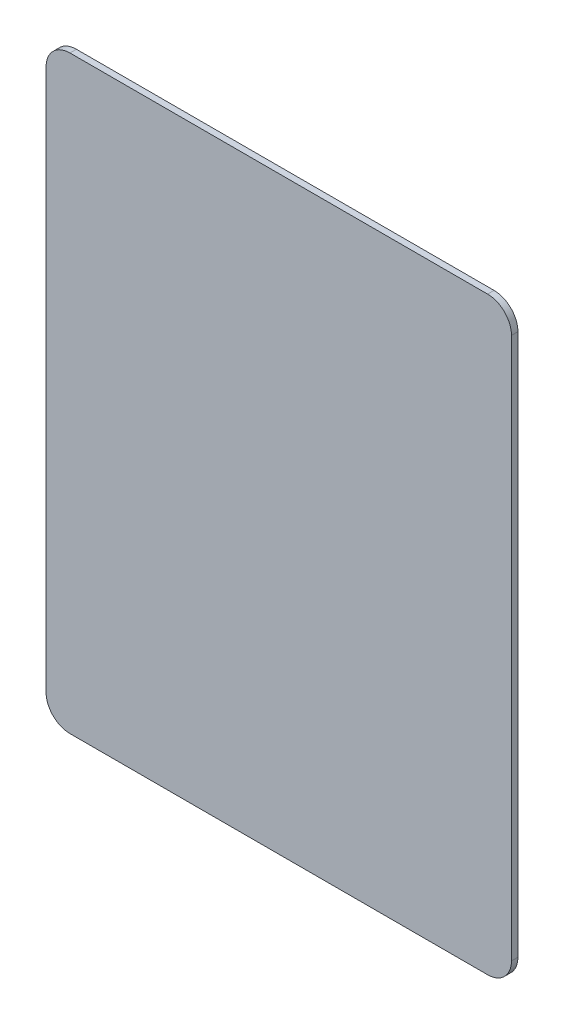
ISO-10303-21;
HEADER;
FILE_DESCRIPTION(('STEP AP214'),'2;1');
FILE_NAME('part.step','',(''),(''),'','','');
FILE_SCHEMA(('AUTOMOTIVE_DESIGN { 1 0 10303 214 1 1 1 1 }'));
ENDSEC;
DATA;
#1=APPLICATION_CONTEXT('core data for automotive mechanical design processes');
#2=APPLICATION_PROTOCOL_DEFINITION('international standard','automotive_design',2000,#1);
#3=PRODUCT_CONTEXT('',#1,'mechanical');
#4=PRODUCT('Part','Part','',(#3));
#5=PRODUCT_RELATED_PRODUCT_CATEGORY('part','',(#4));
#6=PRODUCT_DEFINITION_FORMATION('','',#4);
#7=PRODUCT_DEFINITION_CONTEXT('part definition',#1,'design');
#8=PRODUCT_DEFINITION('design','',#6,#7);
#9=PRODUCT_DEFINITION_SHAPE('','',#8);
#10=(LENGTH_UNIT() NAMED_UNIT(*) SI_UNIT(.MILLI.,.METRE.));
#11=(NAMED_UNIT(*) PLANE_ANGLE_UNIT() SI_UNIT($,.RADIAN.));
#12=(NAMED_UNIT(*) SI_UNIT($,.STERADIAN.) SOLID_ANGLE_UNIT());
#13=UNCERTAINTY_MEASURE_WITH_UNIT(LENGTH_MEASURE(1.E-05),#10,'distance_accuracy_value','');
#14=(GEOMETRIC_REPRESENTATION_CONTEXT(3) GLOBAL_UNCERTAINTY_ASSIGNED_CONTEXT((#13)) GLOBAL_UNIT_ASSIGNED_CONTEXT((#10,
#11,#12)) REPRESENTATION_CONTEXT('',''));
#15=CARTESIAN_POINT('',(0.,0.,0.));
#16=DIRECTION('',(0.,0.,1.));
#17=DIRECTION('',(1.,0.,0.));
#18=AXIS2_PLACEMENT_3D('',#15,#16,#17);
#19=CARTESIAN_POINT('',(61.2595056750672,0.,2.7));
#20=DIRECTION('',(0.,0.,-1.));
#21=DIRECTION('',(-1.,0.,0.));
#22=AXIS2_PLACEMENT_3D('',#19,#20,#21);
#23=CYLINDRICAL_SURFACE('',#22,10.);
#24=CARTESIAN_POINT('',(61.2595056750672,0.,0.));
#25=DIRECTION('',(0.,0.,1.));
#26=DIRECTION('',(1.,0.,0.));
#27=AXIS2_PLACEMENT_3D('',#24,#25,#26);
#28=CIRCLE('',#27,10.);
#29=CARTESIAN_POINT('',(51.2595056750672,0.,0.));
#30=VERTEX_POINT('',#29);
#31=CARTESIAN_POINT('',(61.2595056750673,-10.,0.));
#32=VERTEX_POINT('',#31);
#33=EDGE_CURVE('E133',#30,#32,#28,.T.);
#34=ORIENTED_EDGE('',*,*,#33,.T.);
#35=DIRECTION('',(0.,0.,-1.));
#36=VECTOR('',#35,1.);
#37=CARTESIAN_POINT('',(61.2595056750673,-10.,2.7));
#38=LINE('',#37,#36);
#39=CARTESIAN_POINT('',(61.2595056750673,-10.,2.7));
#40=VERTEX_POINT('',#39);
#41=EDGE_CURVE('E11',#40,#32,#38,.T.);
#42=ORIENTED_EDGE('',*,*,#41,.F.);
#43=CARTESIAN_POINT('',(61.2595056750672,0.,2.7));
#44=DIRECTION('',(0.,0.,1.));
#45=DIRECTION('',(1.,0.,0.));
#46=AXIS2_PLACEMENT_3D('',#43,#44,#45);
#47=CIRCLE('',#46,10.);
#48=CARTESIAN_POINT('',(51.2595056750672,0.,2.7));
#49=VERTEX_POINT('',#48);
#50=EDGE_CURVE('E147',#49,#40,#47,.T.);
#51=ORIENTED_EDGE('',*,*,#50,.F.);
#52=DIRECTION('',(0.,0.,-1.));
#53=VECTOR('',#52,1.);
#54=CARTESIAN_POINT('',(51.2595056750672,0.,2.7));
#55=LINE('',#54,#53);
#56=EDGE_CURVE('E129',#49,#30,#55,.T.);
#57=ORIENTED_EDGE('',*,*,#56,.T.);
#58=EDGE_LOOP('',(#34,#42,#51,#57));
#59=FACE_BOUND('',#58,.T.);
#60=ADVANCED_FACE('F37',(#59),#23,.T.);
#61=CARTESIAN_POINT('',(61.2595056750673,-10.,2.7));
#62=DIRECTION('',(0.,1.,0.));
#63=DIRECTION('',(0.,0.,1.));
#64=AXIS2_PLACEMENT_3D('',#61,#62,#63);
#65=PLANE('',#64);
#66=DIRECTION('',(1.,0.,0.));
#67=VECTOR('',#66,1.);
#68=CARTESIAN_POINT('',(61.2595056750673,-10.,0.));
#69=LINE('',#68,#67);
#70=CARTESIAN_POINT('',(236.259505675067,-10.,0.));
#71=VERTEX_POINT('',#70);
#72=EDGE_CURVE('E136',#32,#71,#69,.T.);
#73=ORIENTED_EDGE('',*,*,#72,.T.);
#74=DIRECTION('',(0.,0.,-1.));
#75=VECTOR('',#74,1.);
#76=CARTESIAN_POINT('',(236.259505675067,-10.,2.7));
#77=LINE('',#76,#75);
#78=CARTESIAN_POINT('',(236.259505675067,-10.,2.7));
#79=VERTEX_POINT('',#78);
#80=EDGE_CURVE('E45',#79,#71,#77,.T.);
#81=ORIENTED_EDGE('',*,*,#80,.F.);
#82=DIRECTION('',(1.,0.,0.));
#83=VECTOR('',#82,1.);
#84=CARTESIAN_POINT('',(61.2595056750673,-10.,2.7));
#85=LINE('',#84,#83);
#86=EDGE_CURVE('E96',#40,#79,#85,.T.);
#87=ORIENTED_EDGE('',*,*,#86,.F.);
#88=ORIENTED_EDGE('',*,*,#41,.T.);
#89=EDGE_LOOP('',(#73,#81,#87,#88));
#90=FACE_BOUND('',#89,.T.);
#91=ADVANCED_FACE('F182',(#90),#65,.F.);
#92=CARTESIAN_POINT('',(236.259505675067,0.,2.7));
#93=DIRECTION('',(0.,0.,-1.));
#94=DIRECTION('',(-1.,0.,0.));
#95=AXIS2_PLACEMENT_3D('',#92,#93,#94);
#96=CYLINDRICAL_SURFACE('',#95,10.);
#97=CARTESIAN_POINT('',(236.259505675067,0.,0.));
#98=DIRECTION('',(0.,0.,1.));
#99=DIRECTION('',(1.,0.,0.));
#100=AXIS2_PLACEMENT_3D('',#97,#98,#99);
#101=CIRCLE('',#100,10.);
#102=CARTESIAN_POINT('',(246.259505675067,0.,0.));
#103=VERTEX_POINT('',#102);
#104=EDGE_CURVE('E138',#71,#103,#101,.T.);
#105=ORIENTED_EDGE('',*,*,#104,.T.);
#106=DIRECTION('',(0.,0.,-1.));
#107=VECTOR('',#106,1.);
#108=CARTESIAN_POINT('',(246.259505675067,0.,2.7));
#109=LINE('',#108,#107);
#110=CARTESIAN_POINT('',(246.259505675067,0.,2.7));
#111=VERTEX_POINT('',#110);
#112=EDGE_CURVE('E154',#111,#103,#109,.T.);
#113=ORIENTED_EDGE('',*,*,#112,.F.);
#114=CARTESIAN_POINT('',(236.259505675067,0.,2.7));
#115=DIRECTION('',(0.,0.,1.));
#116=DIRECTION('',(1.,0.,0.));
#117=AXIS2_PLACEMENT_3D('',#114,#115,#116);
#118=CIRCLE('',#117,10.);
#119=EDGE_CURVE('E162',#79,#111,#118,.T.);
#120=ORIENTED_EDGE('',*,*,#119,.F.);
#121=ORIENTED_EDGE('',*,*,#80,.T.);
#122=EDGE_LOOP('',(#105,#113,#120,#121));
#123=FACE_BOUND('',#122,.T.);
#124=ADVANCED_FACE('F160',(#123),#96,.T.);
#125=CARTESIAN_POINT('',(246.259505675067,227.,2.7));
#126=DIRECTION('',(-1.,0.,0.));
#127=DIRECTION('',(0.,-1.,0.));
#128=AXIS2_PLACEMENT_3D('',#125,#126,#127);
#129=PLANE('',#128);
#130=DIRECTION('',(0.,1.,0.));
#131=VECTOR('',#130,1.);
#132=CARTESIAN_POINT('',(246.259505675067,227.,0.));
#133=LINE('',#132,#131);
#134=CARTESIAN_POINT('',(246.259505675067,227.,0.));
#135=VERTEX_POINT('',#134);
#136=EDGE_CURVE('E140',#103,#135,#133,.T.);
#137=ORIENTED_EDGE('',*,*,#136,.T.);
#138=DIRECTION('',(0.,0.,-1.));
#139=VECTOR('',#138,1.);
#140=CARTESIAN_POINT('',(246.259505675067,227.,2.7));
#141=LINE('',#140,#139);
#142=CARTESIAN_POINT('',(246.259505675067,227.,2.7));
#143=VERTEX_POINT('',#142);
#144=EDGE_CURVE('E151',#143,#135,#141,.T.);
#145=ORIENTED_EDGE('',*,*,#144,.F.);
#146=DIRECTION('',(0.,1.,0.));
#147=VECTOR('',#146,1.);
#148=CARTESIAN_POINT('',(246.259505675067,227.,2.7));
#149=LINE('',#148,#147);
#150=EDGE_CURVE('E174',#111,#143,#149,.T.);
#151=ORIENTED_EDGE('',*,*,#150,.F.);
#152=ORIENTED_EDGE('',*,*,#112,.T.);
#153=EDGE_LOOP('',(#137,#145,#151,#152));
#154=FACE_BOUND('',#153,.T.);
#155=ADVANCED_FACE('F170',(#154),#129,.F.);
#156=CARTESIAN_POINT('',(236.259505675067,227.,2.7));
#157=DIRECTION('',(0.,0.,-1.));
#158=DIRECTION('',(-1.,0.,0.));
#159=AXIS2_PLACEMENT_3D('',#156,#157,#158);
#160=CYLINDRICAL_SURFACE('',#159,10.);
#161=CARTESIAN_POINT('',(236.259505675067,227.,0.));
#162=DIRECTION('',(0.,0.,1.));
#163=DIRECTION('',(-1.,0.,0.));
#164=AXIS2_PLACEMENT_3D('',#161,#162,#163);
#165=CIRCLE('',#164,10.);
#166=CARTESIAN_POINT('',(236.259505675067,237.,0.));
#167=VERTEX_POINT('',#166);
#168=EDGE_CURVE('E142',#135,#167,#165,.T.);
#169=ORIENTED_EDGE('',*,*,#168,.T.);
#170=DIRECTION('',(0.,0.,-1.));
#171=VECTOR('',#170,1.);
#172=CARTESIAN_POINT('',(236.259505675067,237.,2.7));
#173=LINE('',#172,#171);
#174=CARTESIAN_POINT('',(236.259505675067,237.,2.7));
#175=VERTEX_POINT('',#174);
#176=EDGE_CURVE('E124',#175,#167,#173,.T.);
#177=ORIENTED_EDGE('',*,*,#176,.F.);
#178=CARTESIAN_POINT('',(236.259505675067,227.,2.7));
#179=DIRECTION('',(0.,0.,1.));
#180=DIRECTION('',(-1.,0.,0.));
#181=AXIS2_PLACEMENT_3D('',#178,#179,#180);
#182=CIRCLE('',#181,10.);
#183=EDGE_CURVE('E115',#143,#175,#182,.T.);
#184=ORIENTED_EDGE('',*,*,#183,.F.);
#185=ORIENTED_EDGE('',*,*,#144,.T.);
#186=EDGE_LOOP('',(#169,#177,#184,#185));
#187=FACE_BOUND('',#186,.T.);
#188=ADVANCED_FACE('F173',(#187),#160,.T.);
#189=CARTESIAN_POINT('',(61.2595056750673,237.,2.7));
#190=DIRECTION('',(0.,-1.,0.));
#191=DIRECTION('',(0.,0.,-1.));
#192=AXIS2_PLACEMENT_3D('',#189,#190,#191);
#193=PLANE('',#192);
#194=DIRECTION('',(-1.,0.,0.));
#195=VECTOR('',#194,1.);
#196=CARTESIAN_POINT('',(61.2595056750673,237.,0.));
#197=LINE('',#196,#195);
#198=CARTESIAN_POINT('',(61.2595056750673,237.,0.));
#199=VERTEX_POINT('',#198);
#200=EDGE_CURVE('E123',#167,#199,#197,.T.);
#201=ORIENTED_EDGE('',*,*,#200,.T.);
#202=DIRECTION('',(0.,0.,-1.));
#203=VECTOR('',#202,1.);
#204=CARTESIAN_POINT('',(61.2595056750673,237.,2.7));
#205=LINE('',#204,#203);
#206=CARTESIAN_POINT('',(61.2595056750673,237.,2.7));
#207=VERTEX_POINT('',#206);
#208=EDGE_CURVE('E120',#207,#199,#205,.T.);
#209=ORIENTED_EDGE('',*,*,#208,.F.);
#210=DIRECTION('',(-1.,0.,0.));
#211=VECTOR('',#210,1.);
#212=CARTESIAN_POINT('',(61.2595056750673,237.,2.7));
#213=LINE('',#212,#211);
#214=EDGE_CURVE('E109',#175,#207,#213,.T.);
#215=ORIENTED_EDGE('',*,*,#214,.F.);
#216=ORIENTED_EDGE('',*,*,#176,.T.);
#217=EDGE_LOOP('',(#201,#209,#215,#216));
#218=FACE_BOUND('',#217,.T.);
#219=ADVANCED_FACE('F121',(#218),#193,.F.);
#220=CARTESIAN_POINT('',(61.2595056750672,227.,2.7));
#221=DIRECTION('',(0.,0.,-1.));
#222=DIRECTION('',(-1.,0.,0.));
#223=AXIS2_PLACEMENT_3D('',#220,#221,#222);
#224=CYLINDRICAL_SURFACE('',#223,10.);
#225=CARTESIAN_POINT('',(61.2595056750672,227.,0.));
#226=DIRECTION('',(0.,0.,1.));
#227=DIRECTION('',(1.,0.,0.));
#228=AXIS2_PLACEMENT_3D('',#225,#226,#227);
#229=CIRCLE('',#228,10.);
#230=CARTESIAN_POINT('',(51.2595056750672,227.,0.));
#231=VERTEX_POINT('',#230);
#232=EDGE_CURVE('E82',#199,#231,#229,.T.);
#233=ORIENTED_EDGE('',*,*,#232,.T.);
#234=DIRECTION('',(0.,0.,-1.));
#235=VECTOR('',#234,1.);
#236=CARTESIAN_POINT('',(51.2595056750672,227.,2.7));
#237=LINE('',#236,#235);
#238=CARTESIAN_POINT('',(51.2595056750672,227.,2.7));
#239=VERTEX_POINT('',#238);
#240=EDGE_CURVE('E125',#239,#231,#237,.T.);
#241=ORIENTED_EDGE('',*,*,#240,.F.);
#242=CARTESIAN_POINT('',(61.2595056750672,227.,2.7));
#243=DIRECTION('',(0.,0.,1.));
#244=DIRECTION('',(1.,0.,0.));
#245=AXIS2_PLACEMENT_3D('',#242,#243,#244);
#246=CIRCLE('',#245,10.);
#247=EDGE_CURVE('E113',#207,#239,#246,.T.);
#248=ORIENTED_EDGE('',*,*,#247,.F.);
#249=ORIENTED_EDGE('',*,*,#208,.T.);
#250=EDGE_LOOP('',(#233,#241,#248,#249));
#251=FACE_BOUND('',#250,.T.);
#252=ADVANCED_FACE('F127',(#251),#224,.T.);
#253=CARTESIAN_POINT('',(51.2595056750672,0.,2.7));
#254=DIRECTION('',(1.,0.,0.));
#255=DIRECTION('',(0.,1.,0.));
#256=AXIS2_PLACEMENT_3D('',#253,#254,#255);
#257=PLANE('',#256);
#258=DIRECTION('',(0.,-1.,0.));
#259=VECTOR('',#258,1.);
#260=CARTESIAN_POINT('',(51.2595056750672,0.,0.));
#261=LINE('',#260,#259);
#262=EDGE_CURVE('E88',#231,#30,#261,.T.);
#263=ORIENTED_EDGE('',*,*,#262,.T.);
#264=ORIENTED_EDGE('',*,*,#56,.F.);
#265=DIRECTION('',(0.,-1.,0.));
#266=VECTOR('',#265,1.);
#267=CARTESIAN_POINT('',(51.2595056750672,0.,2.7));
#268=LINE('',#267,#266);
#269=EDGE_CURVE('E53',#239,#49,#268,.T.);
#270=ORIENTED_EDGE('',*,*,#269,.F.);
#271=ORIENTED_EDGE('',*,*,#240,.T.);
#272=EDGE_LOOP('',(#263,#264,#270,#271));
#273=FACE_BOUND('',#272,.T.);
#274=ADVANCED_FACE('F198',(#273),#257,.F.);
#275=CARTESIAN_POINT('',(61.2595056750672,0.,2.7));
#276=DIRECTION('',(0.,0.,1.));
#277=DIRECTION('',(1.,0.,0.));
#278=AXIS2_PLACEMENT_3D('',#275,#276,#277);
#279=PLANE('',#278);
#280=ORIENTED_EDGE('',*,*,#50,.T.);
#281=ORIENTED_EDGE('',*,*,#86,.T.);
#282=ORIENTED_EDGE('',*,*,#119,.T.);
#283=ORIENTED_EDGE('',*,*,#150,.T.);
#284=ORIENTED_EDGE('',*,*,#183,.T.);
#285=ORIENTED_EDGE('',*,*,#214,.T.);
#286=ORIENTED_EDGE('',*,*,#247,.T.);
#287=ORIENTED_EDGE('',*,*,#269,.T.);
#288=EDGE_LOOP('',(#280,#281,#282,#283,#284,#285,#286,#287));
#289=FACE_BOUND('',#288,.T.);
#290=ADVANCED_FACE('F111',(#289),#279,.T.);
#291=CARTESIAN_POINT('',(61.2595056750672,0.,0.));
#292=DIRECTION('',(0.,0.,1.));
#293=DIRECTION('',(1.,0.,0.));
#294=AXIS2_PLACEMENT_3D('',#291,#292,#293);
#295=PLANE('',#294);
#296=ORIENTED_EDGE('',*,*,#33,.F.);
#297=ORIENTED_EDGE('',*,*,#262,.F.);
#298=ORIENTED_EDGE('',*,*,#232,.F.);
#299=ORIENTED_EDGE('',*,*,#200,.F.);
#300=ORIENTED_EDGE('',*,*,#168,.F.);
#301=ORIENTED_EDGE('',*,*,#136,.F.);
#302=ORIENTED_EDGE('',*,*,#104,.F.);
#303=ORIENTED_EDGE('',*,*,#72,.F.);
#304=EDGE_LOOP('',(#296,#297,#298,#299,#300,#301,#302,#303));
#305=FACE_BOUND('',#304,.T.);
#306=ADVANCED_FACE('F166',(#305),#295,.F.);
#307=CLOSED_SHELL('',(#60,#91,#124,#155,#188,#219,#252,#274,#290,#306));
#308=MANIFOLD_SOLID_BREP('B2',#307);
#309=ADVANCED_BREP_SHAPE_REPRESENTATION('',(#18,#308),#14);
#310=SHAPE_DEFINITION_REPRESENTATION(#9,#309);
ENDSEC;
END-ISO-10303-21;
